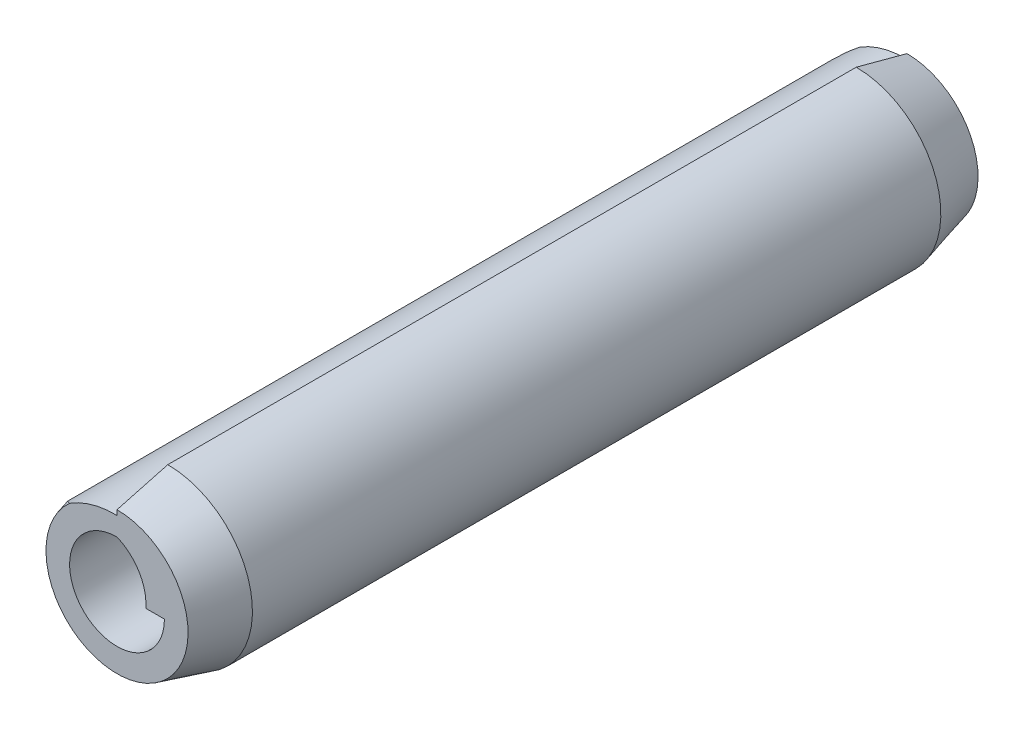
ISO-10303-21;
HEADER;
FILE_DESCRIPTION(('STEP AP214'),'2;1');
FILE_NAME('part.step','',(''),(''),'','','');
FILE_SCHEMA(('AUTOMOTIVE_DESIGN { 1 0 10303 214 1 1 1 1 }'));
ENDSEC;
DATA;
#1=APPLICATION_CONTEXT('core data for automotive mechanical design processes');
#2=APPLICATION_PROTOCOL_DEFINITION('international standard','automotive_design',2000,#1);
#3=PRODUCT_CONTEXT('',#1,'mechanical');
#4=PRODUCT('Part','Part','',(#3));
#5=PRODUCT_RELATED_PRODUCT_CATEGORY('part','',(#4));
#6=PRODUCT_DEFINITION_FORMATION('','',#4);
#7=PRODUCT_DEFINITION_CONTEXT('part definition',#1,'design');
#8=PRODUCT_DEFINITION('design','',#6,#7);
#9=PRODUCT_DEFINITION_SHAPE('','',#8);
#10=(LENGTH_UNIT() NAMED_UNIT(*) SI_UNIT(.MILLI.,.METRE.));
#11=(NAMED_UNIT(*) PLANE_ANGLE_UNIT() SI_UNIT($,.RADIAN.));
#12=(NAMED_UNIT(*) SI_UNIT($,.STERADIAN.) SOLID_ANGLE_UNIT());
#13=UNCERTAINTY_MEASURE_WITH_UNIT(LENGTH_MEASURE(1.E-05),#10,'distance_accuracy_value','');
#14=(GEOMETRIC_REPRESENTATION_CONTEXT(3) GLOBAL_UNCERTAINTY_ASSIGNED_CONTEXT((#13)) GLOBAL_UNIT_ASSIGNED_CONTEXT((#10,
#11,#12)) REPRESENTATION_CONTEXT('',''));
#15=CARTESIAN_POINT('',(0.,0.,0.));
#16=DIRECTION('',(0.,0.,1.));
#17=DIRECTION('',(1.,0.,0.));
#18=AXIS2_PLACEMENT_3D('',#15,#16,#17);
#19=CARTESIAN_POINT('',(0.0422662848344348,-0.0239831586935298,0.));
#20=DIRECTION('',(0.,0.,1.));
#21=DIRECTION('',(1.,0.,0.));
#22=AXIS2_PLACEMENT_3D('',#19,#20,#21);
#23=PLANE('',#22);
#24=CARTESIAN_POINT('',(0.,0.,0.));
#25=DIRECTION('',(0.,0.,-1.));
#26=DIRECTION('',(0.,-1.,0.));
#27=AXIS2_PLACEMENT_3D('',#24,#25,#26);
#28=CIRCLE('',#27,1.25884572681199);
#29=CARTESIAN_POINT('',(0.,1.25884572681199,0.));
#30=VERTEX_POINT('',#29);
#31=CARTESIAN_POINT('',(-0.841572662008659,0.936188025170406,0.));
#32=VERTEX_POINT('',#31);
#33=EDGE_CURVE('E132',#30,#32,#28,.T.);
#34=ORIENTED_EDGE('',*,*,#33,.T.);
#35=CARTESIAN_POINT('',(-0.0366492761898905,-0.329552210012962,0.));
#36=DIRECTION('',(0.,0.,1.));
#37=DIRECTION('',(1.,0.,0.));
#38=AXIS2_PLACEMENT_3D('',#35,#36,#37);
#39=CIRCLE('',#38,1.5);
#40=CARTESIAN_POINT('',(0.,1.17,0.));
#41=VERTEX_POINT('',#40);
#42=EDGE_CURVE('E11',#41,#32,#39,.T.);
#43=ORIENTED_EDGE('',*,*,#42,.F.);
#44=DIRECTION('',(0.,-1.,0.));
#45=VECTOR('',#44,1.);
#46=CARTESIAN_POINT('',(0.,1.5,0.));
#47=LINE('',#46,#45);
#48=EDGE_CURVE('E83',#30,#41,#47,.T.);
#49=ORIENTED_EDGE('',*,*,#48,.F.);
#50=EDGE_LOOP('',(#34,#43,#49));
#51=FACE_BOUND('',#50,.T.);
#52=CARTESIAN_POINT('',(-0.327370065185238,0.0664181747089632,0.));
#53=DIRECTION('',(0.,0.,1.));
#54=DIRECTION('',(0.,-1.,0.));
#55=AXIS2_PLACEMENT_3D('',#52,#53,#54);
#56=CIRCLE('',#55,0.84);
#57=CARTESIAN_POINT('',(0.51,0.,0.));
#58=VERTEX_POINT('',#57);
#59=CARTESIAN_POINT('',(0.,0.84,0.));
#60=VERTEX_POINT('',#59);
#61=EDGE_CURVE('E102',#58,#60,#56,.T.);
#62=ORIENTED_EDGE('',*,*,#61,.T.);
#63=CARTESIAN_POINT('',(0.,0.,0.));
#64=DIRECTION('',(0.,0.,1.));
#65=DIRECTION('',(0.,-1.,0.));
#66=AXIS2_PLACEMENT_3D('',#63,#64,#65);
#67=CIRCLE('',#66,0.84);
#68=CARTESIAN_POINT('',(0.84,0.,0.));
#69=VERTEX_POINT('',#68);
#70=EDGE_CURVE('E104',#60,#69,#67,.T.);
#71=ORIENTED_EDGE('',*,*,#70,.T.);
#72=DIRECTION('',(-1.,0.,0.));
#73=VECTOR('',#72,1.);
#74=CARTESIAN_POINT('',(0.358633142417217,0.,0.));
#75=LINE('',#74,#73);
#76=EDGE_CURVE('E106',#69,#58,#75,.T.);
#77=ORIENTED_EDGE('',*,*,#76,.T.);
#78=EDGE_LOOP('',(#62,#71,#77));
#79=FACE_BOUND('',#78,.T.);
#80=ADVANCED_FACE('F17',(#51,#79),#23,.F.);
#81=CARTESIAN_POINT('',(0.0422662848344348,-0.0239831586935298,14.));
#82=DIRECTION('',(0.,0.,1.));
#83=DIRECTION('',(1.,0.,0.));
#84=AXIS2_PLACEMENT_3D('',#81,#82,#83);
#85=PLANE('',#84);
#86=CARTESIAN_POINT('',(0.,0.,14.));
#87=DIRECTION('',(0.,0.,1.));
#88=DIRECTION('',(0.,1.,0.));
#89=AXIS2_PLACEMENT_3D('',#86,#87,#88);
#90=CIRCLE('',#89,1.25884572681199);
#91=CARTESIAN_POINT('',(-0.841572662008659,0.936188025170406,14.));
#92=VERTEX_POINT('',#91);
#93=CARTESIAN_POINT('',(0.,1.25884572681199,14.));
#94=VERTEX_POINT('',#93);
#95=EDGE_CURVE('E136',#92,#94,#90,.T.);
#96=ORIENTED_EDGE('',*,*,#95,.T.);
#97=DIRECTION('',(0.,1.,0.));
#98=VECTOR('',#97,1.);
#99=CARTESIAN_POINT('',(0.,1.5,14.));
#100=LINE('',#99,#98);
#101=CARTESIAN_POINT('',(0.,1.17,14.));
#102=VERTEX_POINT('',#101);
#103=EDGE_CURVE('E126',#102,#94,#100,.T.);
#104=ORIENTED_EDGE('',*,*,#103,.F.);
#105=CARTESIAN_POINT('',(-0.0366492761898905,-0.329552210012962,14.));
#106=DIRECTION('',(0.,0.,-1.));
#107=DIRECTION('',(1.,0.,0.));
#108=AXIS2_PLACEMENT_3D('',#105,#106,#107);
#109=CIRCLE('',#108,1.5);
#110=EDGE_CURVE('E30',#92,#102,#109,.T.);
#111=ORIENTED_EDGE('',*,*,#110,.F.);
#112=EDGE_LOOP('',(#96,#104,#111));
#113=FACE_BOUND('',#112,.T.);
#114=CARTESIAN_POINT('',(-0.327370065185238,0.0664181747089632,14.));
#115=DIRECTION('',(0.,0.,-1.));
#116=DIRECTION('',(0.,-1.,0.));
#117=AXIS2_PLACEMENT_3D('',#114,#115,#116);
#118=CIRCLE('',#117,0.84);
#119=CARTESIAN_POINT('',(0.,0.84,14.));
#120=VERTEX_POINT('',#119);
#121=CARTESIAN_POINT('',(0.51,0.,14.));
#122=VERTEX_POINT('',#121);
#123=EDGE_CURVE('E59',#120,#122,#118,.T.);
#124=ORIENTED_EDGE('',*,*,#123,.T.);
#125=DIRECTION('',(1.,0.,0.));
#126=VECTOR('',#125,1.);
#127=CARTESIAN_POINT('',(0.358633142417217,0.,14.));
#128=LINE('',#127,#126);
#129=CARTESIAN_POINT('',(0.84,0.,14.));
#130=VERTEX_POINT('',#129);
#131=EDGE_CURVE('E51',#122,#130,#128,.T.);
#132=ORIENTED_EDGE('',*,*,#131,.T.);
#133=CARTESIAN_POINT('',(0.,0.,14.));
#134=DIRECTION('',(0.,0.,-1.));
#135=DIRECTION('',(0.,-1.,0.));
#136=AXIS2_PLACEMENT_3D('',#133,#134,#135);
#137=CIRCLE('',#136,0.84);
#138=EDGE_CURVE('E118',#130,#120,#137,.T.);
#139=ORIENTED_EDGE('',*,*,#138,.T.);
#140=EDGE_LOOP('',(#124,#132,#139));
#141=FACE_BOUND('',#140,.T.);
#142=ADVANCED_FACE('F187',(#113,#141),#85,.T.);
#143=CARTESIAN_POINT('',(-0.0366492761898905,-0.329552210012962,0.));
#144=DIRECTION('',(0.,0.,-1.));
#145=DIRECTION('',(1.,0.,0.));
#146=AXIS2_PLACEMENT_3D('',#143,#144,#145);
#147=CYLINDRICAL_SURFACE('',#146,1.5);
#148=CARTESIAN_POINT('',(-0.841535810484129,0.936211459441889,7.12398127102543E-05));
#149=CARTESIAN_POINT('',(-0.86631530623186,0.920451360280375,0.0181538518817806));
#150=CARTESIAN_POINT('',(-0.890407354461554,0.904112400987433,0.0366607436040517));
#151=CARTESIAN_POINT('',(-0.939029854435286,0.869062397398139,0.0758174459990941));
#152=CARTESIAN_POINT('',(-0.963453658077545,0.850265477487421,0.0965230532407118));
#153=CARTESIAN_POINT('',(-1.0124644583368,0.810122171593134,0.14007270826636));
#154=CARTESIAN_POINT('',(-1.03693860096027,0.788689579450807,0.162963885726517));
#155=CARTESIAN_POINT('',(-1.08573456642055,0.743111836421534,0.210897138445712));
#156=CARTESIAN_POINT('',(-1.1099361247027,0.718881164113983,0.235980513311245));
#157=CARTESIAN_POINT('',(-1.14530492543061,0.680992194167517,0.274617043092399));
#158=CARTESIAN_POINT('',(-1.15719026244799,0.667794965693077,0.287971901282868));
#159=CARTESIAN_POINT('',(-1.18077041659957,0.640664015509723,0.315226044497094));
#160=CARTESIAN_POINT('',(-1.19244861746129,0.626720089625879,0.32912958449674));
#161=CARTESIAN_POINT('',(-1.21556355630956,0.598084349839631,0.357480447494981));
#162=CARTESIAN_POINT('',(-1.22698310357375,0.583382600410799,0.371931740774166));
#163=CARTESIAN_POINT('',(-1.24952726667206,0.553222654751529,0.401379282659033));
#164=CARTESIAN_POINT('',(-1.26063409678135,0.537754850474009,0.416379293449251));
#165=CARTESIAN_POINT('',(-1.28705071847516,0.499456109082263,0.453277641409816));
#166=CARTESIAN_POINT('',(-1.30200346259606,0.476443140244359,0.475243581280796));
#167=CARTESIAN_POINT('',(-1.33270198473673,0.426249904412471,0.522628732837542));
#168=CARTESIAN_POINT('',(-1.34823177734472,0.398961227645436,0.548072970974926));
#169=CARTESIAN_POINT('',(-1.37940329011185,0.339973839059538,0.602439003247395));
#170=CARTESIAN_POINT('',(-1.39479651549373,0.308163406498512,0.631382398659163));
#171=CARTESIAN_POINT('',(-1.42209408162448,0.246285362328987,0.686933344891523));
#172=CARTESIAN_POINT('',(-1.43418217187815,0.216293062036928,0.713534804806271));
#173=CARTESIAN_POINT('',(-1.45639927642608,0.155581219796475,0.766759902222844));
#174=CARTESIAN_POINT('',(-1.46652729813496,0.124861318179992,0.79338354413991));
#175=CARTESIAN_POINT('',(-1.48477987705887,0.0628319762175819,0.846664077527937));
#176=CARTESIAN_POINT('',(-1.49290341952511,0.031522245873476,0.873320979001542));
#177=CARTESIAN_POINT('',(-1.50000117710145,-5.22687013359809E-06,0.899993318868682));
#178=B_SPLINE_CURVE_WITH_KNOTS('',3,(#148,#149,#150,#151,#152,#153,#154,#155,#156,#157,#158,
#159,#160,#161,#162,#163,#164,#165,#166,#167,#168,#169,#170,#171,#172,#173,#174,#175,#176,#177),
.UNSPECIFIED.,.F.,.F.,(4,2,2,2,2,2,2,2,2,2,2,2,2,2,4),(0.,0.103438361674107,0.214764016567239,
0.334038135624978,0.461310384817356,0.527966118019949,0.596636517234303,0.667325644477834,
0.740037222731261,0.845459558150675,0.966652458500069,1.1036186962821,1.22918492451662,
1.3548145744773,1.48050769338342),.UNSPECIFIED.);
#179=CARTESIAN_POINT('',(-1.5,0.,0.9));
#180=VERTEX_POINT('',#179);
#181=EDGE_CURVE('E145',#32,#180,#178,.T.);
#182=ORIENTED_EDGE('',*,*,#181,.T.);
#183=DIRECTION('',(0.,0.,1.));
#184=VECTOR('',#183,1.);
#185=CARTESIAN_POINT('',(-1.5,0.,0.));
#186=LINE('',#185,#184);
#187=CARTESIAN_POINT('',(-1.5,0.,13.1));
#188=VERTEX_POINT('',#187);
#189=EDGE_CURVE('E92',#180,#188,#186,.T.);
#190=ORIENTED_EDGE('',*,*,#189,.T.);
#191=CARTESIAN_POINT('',(-1.50000009650202,-4.28509932940725E-07,13.1000005409223));
#192=CARTESIAN_POINT('',(-1.49291957555523,0.0314548261802403,13.1264523778714));
#193=CARTESIAN_POINT('',(-1.48482053374345,0.0626732088407663,13.1529123281275));
#194=CARTESIAN_POINT('',(-1.46663227501448,0.124524959333501,13.2059134444748));
#195=CARTESIAN_POINT('',(-1.45654060582544,0.155157554785591,13.2324546705642));
#196=CARTESIAN_POINT('',(-1.43441808343028,0.215685285812901,13.2856509088078));
#197=CARTESIAN_POINT('',(-1.42238484276611,0.245579460522696,13.3123060212063));
#198=CARTESIAN_POINT('',(-1.39688662790117,0.303469352651168,13.3645203501246));
#199=CARTESIAN_POINT('',(-1.38349364530364,0.331494010648559,13.3900826374088));
#200=CARTESIAN_POINT('',(-1.35500621973657,0.386609634245214,13.4407540561901));
#201=CARTESIAN_POINT('',(-1.33992636279596,0.413706305375969,13.4658651795518));
#202=CARTESIAN_POINT('',(-1.3081571543645,0.466826384269589,13.5156939190395));
#203=CARTESIAN_POINT('',(-1.29148179332862,0.492856695377864,13.5404130752808));
#204=CARTESIAN_POINT('',(-1.26314895165278,0.534197764517397,13.580160528225));
#205=CARTESIAN_POINT('',(-1.25201837321372,0.54979259009051,13.5952712266545));
#206=CARTESIAN_POINT('',(-1.22941388381384,0.580206774770181,13.6249326480306));
#207=CARTESIAN_POINT('',(-1.21795797180835,0.595035653270746,13.6394873029131));
#208=CARTESIAN_POINT('',(-1.19476155092552,0.623920043570482,13.6680451312903));
#209=CARTESIAN_POINT('',(-1.18303834521198,0.637985560017464,13.6820522333191));
#210=CARTESIAN_POINT('',(-1.15935906171806,0.665355095959994,13.7095117574083));
#211=CARTESIAN_POINT('',(-1.14741973284838,0.678669361355793,13.7229684464634));
#212=CARTESIAN_POINT('',(-1.11187531088593,0.716900382104451,13.7619080042325));
#213=CARTESIAN_POINT('',(-1.08754128962865,0.741349911544396,13.7871912629603));
#214=CARTESIAN_POINT('',(-1.03845042961779,0.787342610430195,13.8355188633376));
#215=CARTESIAN_POINT('',(-1.01381473726659,0.808971935647318,13.858604463358));
#216=CARTESIAN_POINT('',(-0.964454916214631,0.849484813114181,13.9025376668077));
#217=CARTESIAN_POINT('',(-0.939844412051042,0.868455353088331,13.9234323017918));
#218=CARTESIAN_POINT('',(-0.890826552194718,0.903828180259347,13.9629619697763));
#219=CARTESIAN_POINT('',(-0.866526478514814,0.920317263448197,13.9816526029445));
#220=CARTESIAN_POINT('',(-0.841529512688774,0.936215464125346,13.9999171039351));
#221=B_SPLINE_CURVE_WITH_KNOTS('',3,(#191,#192,#193,#194,#195,#196,#197,#198,#199,#200,#201,
#202,#203,#204,#205,#206,#207,#208,#209,#210,#211,#212,#213,#214,#215,#216,#217,#218,#219,#220),
.UNSPECIFIED.,.F.,.F.,(4,2,2,2,2,2,2,2,2,2,2,2,2,2,4),(0.,0.125099727066187,0.250354381443124,
0.37576424603216,0.496397330664943,0.616057974096638,0.734751680145126,0.807945041720566,
0.879114894377815,0.948264989743267,1.01539941882069,1.14362590512842,1.26385062313911,
1.37612344373888,1.48050569065646),.UNSPECIFIED.);
#222=EDGE_CURVE('E149',#188,#92,#221,.T.);
#223=ORIENTED_EDGE('',*,*,#222,.T.);
#224=ORIENTED_EDGE('',*,*,#110,.T.);
#225=DIRECTION('',(0.,0.,1.));
#226=VECTOR('',#225,1.);
#227=CARTESIAN_POINT('',(0.,1.17,0.));
#228=LINE('',#227,#226);
#229=EDGE_CURVE('E123',#41,#102,#228,.T.);
#230=ORIENTED_EDGE('',*,*,#229,.F.);
#231=ORIENTED_EDGE('',*,*,#42,.T.);
#232=EDGE_LOOP('',(#182,#190,#223,#224,#230,#231));
#233=FACE_BOUND('',#232,.T.);
#234=ADVANCED_FACE('F19',(#233),#147,.T.);
#235=CARTESIAN_POINT('',(0.,0.,13.55));
#236=DIRECTION('',(0.,0.,-1.));
#237=DIRECTION('',(0.,1.,0.));
#238=AXIS2_PLACEMENT_3D('',#235,#236,#237);
#239=CONICAL_SURFACE('',#238,1.37942286340599,0.261799387799149);
#240=DIRECTION('',(0.,0.258819045102521,-0.965925826289068));
#241=VECTOR('',#240,1.);
#242=CARTESIAN_POINT('',(0.,1.37942286340599,13.55));
#243=LINE('',#242,#241);
#244=CARTESIAN_POINT('',(0.,1.5,13.1));
#245=VERTEX_POINT('',#244);
#246=EDGE_CURVE('E134',#94,#245,#243,.T.);
#247=ORIENTED_EDGE('',*,*,#246,.F.);
#248=ORIENTED_EDGE('',*,*,#95,.F.);
#249=ORIENTED_EDGE('',*,*,#222,.F.);
#250=CARTESIAN_POINT('',(0.,0.,13.1));
#251=DIRECTION('',(0.,0.,-1.));
#252=DIRECTION('',(1.,0.,0.));
#253=AXIS2_PLACEMENT_3D('',#250,#251,#252);
#254=CIRCLE('',#253,1.5);
#255=EDGE_CURVE('E140',#245,#188,#254,.T.);
#256=ORIENTED_EDGE('',*,*,#255,.F.);
#257=EDGE_LOOP('',(#247,#248,#249,#256));
#258=FACE_BOUND('',#257,.T.);
#259=ADVANCED_FACE('F174',(#258),#239,.T.);
#260=CARTESIAN_POINT('',(0.,1.335,0.));
#261=DIRECTION('',(-1.,0.,0.));
#262=DIRECTION('',(0.,-1.,0.));
#263=AXIS2_PLACEMENT_3D('',#260,#261,#262);
#264=PLANE('',#263);
#265=DIRECTION('',(0.,-0.258819045102521,-0.965925826289068));
#266=VECTOR('',#265,1.);
#267=CARTESIAN_POINT('',(0.,1.37942286340599,0.45));
#268=LINE('',#267,#266);
#269=CARTESIAN_POINT('',(0.,1.5,0.9));
#270=VERTEX_POINT('',#269);
#271=EDGE_CURVE('E129',#270,#30,#268,.T.);
#272=ORIENTED_EDGE('',*,*,#271,.T.);
#273=ORIENTED_EDGE('',*,*,#48,.T.);
#274=ORIENTED_EDGE('',*,*,#229,.T.);
#275=ORIENTED_EDGE('',*,*,#103,.T.);
#276=ORIENTED_EDGE('',*,*,#246,.T.);
#277=DIRECTION('',(0.,0.,1.));
#278=VECTOR('',#277,1.);
#279=CARTESIAN_POINT('',(0.,1.5,0.));
#280=LINE('',#279,#278);
#281=EDGE_CURVE('E138',#270,#245,#280,.T.);
#282=ORIENTED_EDGE('',*,*,#281,.F.);
#283=EDGE_LOOP('',(#272,#273,#274,#275,#276,#282));
#284=FACE_BOUND('',#283,.T.);
#285=ADVANCED_FACE('F184',(#284),#264,.T.);
#286=CARTESIAN_POINT('',(0.,0.,0.));
#287=DIRECTION('',(0.,0.,-1.));
#288=DIRECTION('',(1.,0.,0.));
#289=AXIS2_PLACEMENT_3D('',#286,#287,#288);
#290=CYLINDRICAL_SURFACE('',#289,1.5);
#291=CARTESIAN_POINT('',(0.,0.,0.9));
#292=DIRECTION('',(0.,0.,1.));
#293=DIRECTION('',(1.,0.,0.));
#294=AXIS2_PLACEMENT_3D('',#291,#292,#293);
#295=CIRCLE('',#294,1.5);
#296=EDGE_CURVE('E131',#180,#270,#295,.T.);
#297=ORIENTED_EDGE('',*,*,#296,.T.);
#298=ORIENTED_EDGE('',*,*,#281,.T.);
#299=ORIENTED_EDGE('',*,*,#255,.T.);
#300=ORIENTED_EDGE('',*,*,#189,.F.);
#301=EDGE_LOOP('',(#297,#298,#299,#300));
#302=FACE_BOUND('',#301,.T.);
#303=ADVANCED_FACE('F190',(#302),#290,.T.);
#304=CARTESIAN_POINT('',(0.,0.,0.45));
#305=DIRECTION('',(0.,0.,1.));
#306=DIRECTION('',(0.,-1.,0.));
#307=AXIS2_PLACEMENT_3D('',#304,#305,#306);
#308=CONICAL_SURFACE('',#307,1.37942286340599,0.261799387799149);
#309=ORIENTED_EDGE('',*,*,#181,.F.);
#310=ORIENTED_EDGE('',*,*,#33,.F.);
#311=ORIENTED_EDGE('',*,*,#271,.F.);
#312=ORIENTED_EDGE('',*,*,#296,.F.);
#313=EDGE_LOOP('',(#309,#310,#311,#312));
#314=FACE_BOUND('',#313,.T.);
#315=ADVANCED_FACE('F192',(#314),#308,.T.);
#316=CARTESIAN_POINT('',(0.675,0.,-1.));
#317=DIRECTION('',(0.,1.,0.));
#318=DIRECTION('',(-1.,0.,0.));
#319=AXIS2_PLACEMENT_3D('',#316,#317,#318);
#320=PLANE('',#319);
#321=ORIENTED_EDGE('',*,*,#131,.F.);
#322=DIRECTION('',(0.,0.,1.));
#323=VECTOR('',#322,1.);
#324=CARTESIAN_POINT('',(0.51,0.,-1.));
#325=LINE('',#324,#323);
#326=EDGE_CURVE('E108',#58,#122,#325,.T.);
#327=ORIENTED_EDGE('',*,*,#326,.F.);
#328=ORIENTED_EDGE('',*,*,#76,.F.);
#329=DIRECTION('',(0.,0.,1.));
#330=VECTOR('',#329,1.);
#331=CARTESIAN_POINT('',(0.84,0.,-1.));
#332=LINE('',#331,#330);
#333=EDGE_CURVE('E116',#69,#130,#332,.T.);
#334=ORIENTED_EDGE('',*,*,#333,.T.);
#335=EDGE_LOOP('',(#321,#327,#328,#334));
#336=FACE_BOUND('',#335,.T.);
#337=ADVANCED_FACE('F196',(#336),#320,.F.);
#338=CARTESIAN_POINT('',(-0.327370065185238,0.0664181747089632,-1.));
#339=DIRECTION('',(0.,0.,-1.));
#340=DIRECTION('',(0.,-1.,0.));
#341=AXIS2_PLACEMENT_3D('',#338,#339,#340);
#342=CYLINDRICAL_SURFACE('',#341,0.84);
#343=ORIENTED_EDGE('',*,*,#123,.F.);
#344=DIRECTION('',(0.,0.,1.));
#345=VECTOR('',#344,1.);
#346=CARTESIAN_POINT('',(0.,0.84,-1.));
#347=LINE('',#346,#345);
#348=EDGE_CURVE('E110',#60,#120,#347,.T.);
#349=ORIENTED_EDGE('',*,*,#348,.F.);
#350=ORIENTED_EDGE('',*,*,#61,.F.);
#351=ORIENTED_EDGE('',*,*,#326,.T.);
#352=EDGE_LOOP('',(#343,#349,#350,#351));
#353=FACE_BOUND('',#352,.T.);
#354=ADVANCED_FACE('F111',(#353),#342,.F.);
#355=CARTESIAN_POINT('',(0.,0.,-1.));
#356=DIRECTION('',(0.,0.,-1.));
#357=DIRECTION('',(0.,-1.,0.));
#358=AXIS2_PLACEMENT_3D('',#355,#356,#357);
#359=CYLINDRICAL_SURFACE('',#358,0.84);
#360=ORIENTED_EDGE('',*,*,#138,.F.);
#361=ORIENTED_EDGE('',*,*,#333,.F.);
#362=ORIENTED_EDGE('',*,*,#70,.F.);
#363=ORIENTED_EDGE('',*,*,#348,.T.);
#364=EDGE_LOOP('',(#360,#361,#362,#363));
#365=FACE_BOUND('',#364,.T.);
#366=ADVANCED_FACE('F115',(#365),#359,.F.);
#367=CLOSED_SHELL('',(#80,#142,#234,#259,#285,#303,#315,#337,#354,#366));
#368=MANIFOLD_SOLID_BREP('B1',#367);
#369=ADVANCED_BREP_SHAPE_REPRESENTATION('',(#18,#368),#14);
#370=SHAPE_DEFINITION_REPRESENTATION(#9,#369);
ENDSEC;
END-ISO-10303-21;
